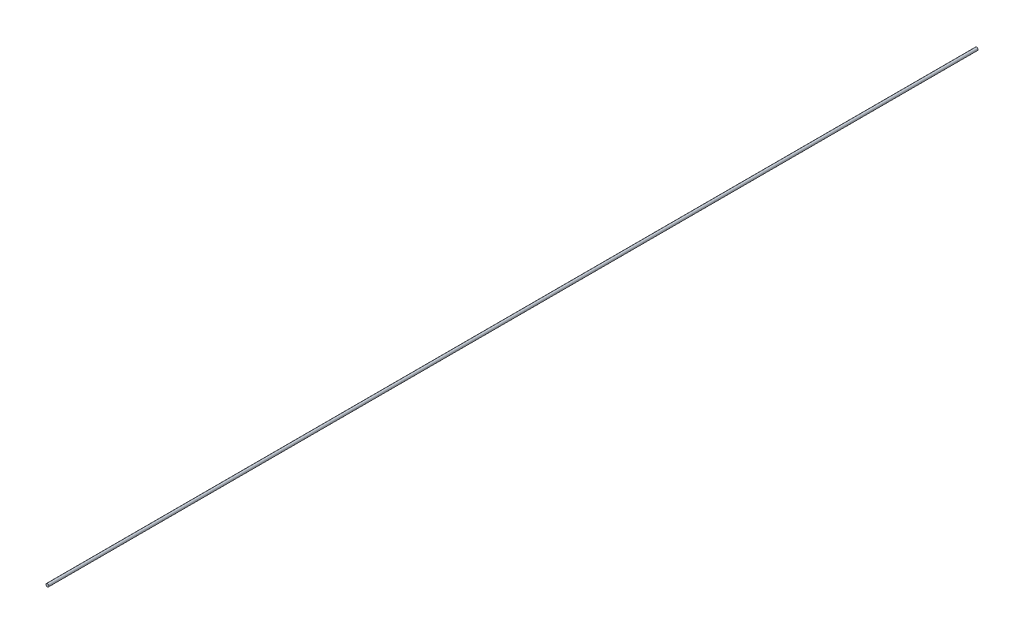
ISO-10303-21;
HEADER;
FILE_DESCRIPTION(('STEP AP214'),'2;1');
FILE_NAME('part.step','',(''),(''),'','','');
FILE_SCHEMA(('AUTOMOTIVE_DESIGN { 1 0 10303 214 1 1 1 1 }'));
ENDSEC;
DATA;
#1=APPLICATION_CONTEXT('core data for automotive mechanical design processes');
#2=APPLICATION_PROTOCOL_DEFINITION('international standard','automotive_design',2000,#1);
#3=PRODUCT_CONTEXT('',#1,'mechanical');
#4=PRODUCT('Part','Part','',(#3));
#5=PRODUCT_RELATED_PRODUCT_CATEGORY('part','',(#4));
#6=PRODUCT_DEFINITION_FORMATION('','',#4);
#7=PRODUCT_DEFINITION_CONTEXT('part definition',#1,'design');
#8=PRODUCT_DEFINITION('design','',#6,#7);
#9=PRODUCT_DEFINITION_SHAPE('','',#8);
#10=(LENGTH_UNIT() NAMED_UNIT(*) SI_UNIT(.MILLI.,.METRE.));
#11=(NAMED_UNIT(*) PLANE_ANGLE_UNIT() SI_UNIT($,.RADIAN.));
#12=(NAMED_UNIT(*) SI_UNIT($,.STERADIAN.) SOLID_ANGLE_UNIT());
#13=UNCERTAINTY_MEASURE_WITH_UNIT(LENGTH_MEASURE(1.E-05),#10,'distance_accuracy_value','');
#14=(GEOMETRIC_REPRESENTATION_CONTEXT(3) GLOBAL_UNCERTAINTY_ASSIGNED_CONTEXT((#13)) GLOBAL_UNIT_ASSIGNED_CONTEXT((#10,
#11,#12)) REPRESENTATION_CONTEXT('',''));
#15=CARTESIAN_POINT('',(0.,0.,0.));
#16=DIRECTION('',(0.,0.,1.));
#17=DIRECTION('',(1.,0.,0.));
#18=AXIS2_PLACEMENT_3D('',#15,#16,#17);
#19=CARTESIAN_POINT('',(0.,0.,65.));
#20=DIRECTION('',(0.,0.,-1.));
#21=DIRECTION('',(-1.,0.,0.));
#22=AXIS2_PLACEMENT_3D('',#19,#20,#21);
#23=CYLINDRICAL_SURFACE('',#22,0.1);
#24=CARTESIAN_POINT('',(0.,0.,65.));
#25=DIRECTION('',(0.,0.,1.));
#26=DIRECTION('',(1.,0.,0.));
#27=AXIS2_PLACEMENT_3D('',#24,#25,#26);
#28=CIRCLE('',#27,0.1);
#29=CARTESIAN_POINT('',(0.1,0.,65.));
#30=VERTEX_POINT('',#29);
#31=EDGE_CURVE('E10',#30,#30,#28,.T.);
#32=ORIENTED_EDGE('',*,*,#31,.F.);
#33=EDGE_LOOP('',(#32));
#34=FACE_BOUND('',#33,.T.);
#35=CARTESIAN_POINT('',(0.,0.,0.));
#36=DIRECTION('',(0.,0.,1.));
#37=DIRECTION('',(1.,0.,0.));
#38=AXIS2_PLACEMENT_3D('',#35,#36,#37);
#39=CIRCLE('',#38,0.1);
#40=CARTESIAN_POINT('',(0.1,0.,0.));
#41=VERTEX_POINT('',#40);
#42=EDGE_CURVE('E34',#41,#41,#39,.T.);
#43=ORIENTED_EDGE('',*,*,#42,.T.);
#44=EDGE_LOOP('',(#43));
#45=FACE_BOUND('',#44,.T.);
#46=ADVANCED_FACE('F31',(#34,#45),#23,.T.);
#47=CARTESIAN_POINT('',(0.,0.,65.));
#48=DIRECTION('',(0.,0.,1.));
#49=DIRECTION('',(1.,0.,0.));
#50=AXIS2_PLACEMENT_3D('',#47,#48,#49);
#51=PLANE('',#50);
#52=ORIENTED_EDGE('',*,*,#31,.T.);
#53=EDGE_LOOP('',(#52));
#54=FACE_BOUND('',#53,.T.);
#55=ADVANCED_FACE('F46',(#54),#51,.T.);
#56=CARTESIAN_POINT('',(0.,0.,0.));
#57=DIRECTION('',(0.,0.,1.));
#58=DIRECTION('',(1.,0.,0.));
#59=AXIS2_PLACEMENT_3D('',#56,#57,#58);
#60=PLANE('',#59);
#61=ORIENTED_EDGE('',*,*,#42,.F.);
#62=EDGE_LOOP('',(#61));
#63=FACE_BOUND('',#62,.T.);
#64=ADVANCED_FACE('F44',(#63),#60,.F.);
#65=CLOSED_SHELL('',(#46,#55,#64));
#66=MANIFOLD_SOLID_BREP('B2',#65);
#67=ADVANCED_BREP_SHAPE_REPRESENTATION('',(#18,#66),#14);
#68=SHAPE_DEFINITION_REPRESENTATION(#9,#67);
ENDSEC;
END-ISO-10303-21;
